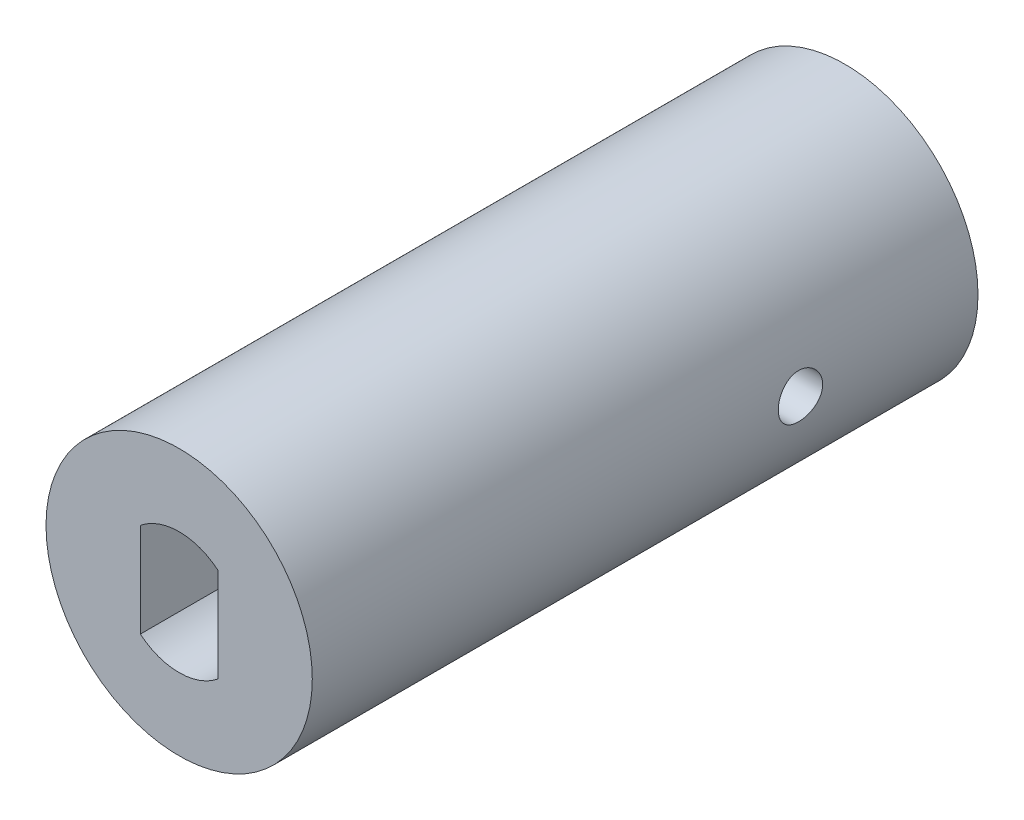
ISO-10303-21;
HEADER;
FILE_DESCRIPTION(('STEP AP214'),'2;1');
FILE_NAME('part.step','',(''),(''),'','','');
FILE_SCHEMA(('AUTOMOTIVE_DESIGN { 1 0 10303 214 1 1 1 1 }'));
ENDSEC;
DATA;
#1=APPLICATION_CONTEXT('core data for automotive mechanical design processes');
#2=APPLICATION_PROTOCOL_DEFINITION('international standard','automotive_design',2000,#1);
#3=PRODUCT_CONTEXT('',#1,'mechanical');
#4=PRODUCT('Part','Part','',(#3));
#5=PRODUCT_RELATED_PRODUCT_CATEGORY('part','',(#4));
#6=PRODUCT_DEFINITION_FORMATION('','',#4);
#7=PRODUCT_DEFINITION_CONTEXT('part definition',#1,'design');
#8=PRODUCT_DEFINITION('design','',#6,#7);
#9=PRODUCT_DEFINITION_SHAPE('','',#8);
#10=(LENGTH_UNIT() NAMED_UNIT(*) SI_UNIT(.MILLI.,.METRE.));
#11=(NAMED_UNIT(*) PLANE_ANGLE_UNIT() SI_UNIT($,.RADIAN.));
#12=(NAMED_UNIT(*) SI_UNIT($,.STERADIAN.) SOLID_ANGLE_UNIT());
#13=UNCERTAINTY_MEASURE_WITH_UNIT(LENGTH_MEASURE(1.E-05),#10,'distance_accuracy_value','');
#14=(GEOMETRIC_REPRESENTATION_CONTEXT(3) GLOBAL_UNCERTAINTY_ASSIGNED_CONTEXT((#13)) GLOBAL_UNIT_ASSIGNED_CONTEXT((#10,
#11,#12)) REPRESENTATION_CONTEXT('',''));
#15=CARTESIAN_POINT('',(0.,0.,0.));
#16=DIRECTION('',(0.,0.,1.));
#17=DIRECTION('',(1.,0.,0.));
#18=AXIS2_PLACEMENT_3D('',#15,#16,#17);
#19=CARTESIAN_POINT('',(0.,0.,30.));
#20=DIRECTION('',(0.,0.,1.));
#21=DIRECTION('',(1.,0.,0.));
#22=AXIS2_PLACEMENT_3D('',#19,#20,#21);
#23=PLANE('',#22);
#24=CARTESIAN_POINT('',(0.,0.,30.));
#25=DIRECTION('',(0.,0.,1.));
#26=DIRECTION('',(1.,0.,0.));
#27=AXIS2_PLACEMENT_3D('',#24,#25,#26);
#28=CIRCLE('',#27,6.);
#29=CARTESIAN_POINT('',(6.,0.,30.));
#30=VERTEX_POINT('',#29);
#31=EDGE_CURVE('E11',#30,#30,#28,.T.);
#32=ORIENTED_EDGE('',*,*,#31,.T.);
#33=EDGE_LOOP('',(#32));
#34=FACE_BOUND('',#33,.T.);
#35=CARTESIAN_POINT('',(0.,0.,30.));
#36=DIRECTION('',(0.,0.,1.));
#37=DIRECTION('',(1.,0.,0.));
#38=AXIS2_PLACEMENT_3D('',#35,#36,#37);
#39=CIRCLE('',#38,2.75);
#40=CARTESIAN_POINT('',(-1.75,-2.12132034355964,30.));
#41=VERTEX_POINT('',#40);
#42=CARTESIAN_POINT('',(1.75,-2.12132034355964,30.));
#43=VERTEX_POINT('',#42);
#44=EDGE_CURVE('E103',#41,#43,#39,.T.);
#45=ORIENTED_EDGE('',*,*,#44,.F.);
#46=DIRECTION('',(0.,1.,0.));
#47=VECTOR('',#46,1.);
#48=CARTESIAN_POINT('',(-1.75,0.,30.));
#49=LINE('',#48,#47);
#50=CARTESIAN_POINT('',(-1.75,2.12132034355964,30.));
#51=VERTEX_POINT('',#50);
#52=EDGE_CURVE('E69',#41,#51,#49,.T.);
#53=ORIENTED_EDGE('',*,*,#52,.T.);
#54=CARTESIAN_POINT('',(0.,0.,30.));
#55=DIRECTION('',(0.,0.,1.));
#56=DIRECTION('',(1.,0.,0.));
#57=AXIS2_PLACEMENT_3D('',#54,#55,#56);
#58=CIRCLE('',#57,2.75);
#59=CARTESIAN_POINT('',(1.75,2.12132034355964,30.));
#60=VERTEX_POINT('',#59);
#61=EDGE_CURVE('E123',#60,#51,#58,.T.);
#62=ORIENTED_EDGE('',*,*,#61,.F.);
#63=DIRECTION('',(0.,1.,0.));
#64=VECTOR('',#63,1.);
#65=CARTESIAN_POINT('',(1.75,0.,30.));
#66=LINE('',#65,#64);
#67=EDGE_CURVE('E134',#43,#60,#66,.T.);
#68=ORIENTED_EDGE('',*,*,#67,.F.);
#69=EDGE_LOOP('',(#45,#53,#62,#68));
#70=FACE_BOUND('',#69,.T.);
#71=ADVANCED_FACE('F45',(#34,#70),#23,.T.);
#72=CARTESIAN_POINT('',(0.,0.,30.));
#73=DIRECTION('',(0.,0.,-1.));
#74=DIRECTION('',(-1.,0.,0.));
#75=AXIS2_PLACEMENT_3D('',#72,#73,#74);
#76=CYLINDRICAL_SURFACE('',#75,6.);
#77=CARTESIAN_POINT('',(-6.,0.,7.));
#78=CARTESIAN_POINT('',(-5.9999990446753,0.0557563619832858,7.00000223557913));
#79=CARTESIAN_POINT('',(-5.99921471165214,0.111543152735528,7.00467890998757));
#80=CARTESIAN_POINT('',(-5.99616137976555,0.221552088669217,7.02325426350613));
#81=CARTESIAN_POINT('',(-5.99389101569556,0.275772747183699,7.03716142276464));
#82=CARTESIAN_POINT('',(-5.9881202729458,0.381041898885057,7.0737661794371));
#83=CARTESIAN_POINT('',(-5.98462090063677,0.43209294737276,7.09645658625623));
#84=CARTESIAN_POINT('',(-5.97677690832828,0.529656736791177,7.14996491682096));
#85=CARTESIAN_POINT('',(-5.97243238501774,0.576169995951436,7.1807819109932));
#86=CARTESIAN_POINT('',(-5.96333326983325,0.663789045716672,7.24998203352818));
#87=CARTESIAN_POINT('',(-5.95857548725943,0.704845161413987,7.28842764585445));
#88=CARTESIAN_POINT('',(-5.94921050750693,0.779955399463971,7.37165918738912));
#89=CARTESIAN_POINT('',(-5.94460331985067,0.814009079756388,7.41644551658264));
#90=CARTESIAN_POINT('',(-5.93603026303912,0.874346850242053,7.51142838647882));
#91=CARTESIAN_POINT('',(-5.93206851636654,0.9005818211444,7.5616565347219));
#92=CARTESIAN_POINT('',(-5.9252791591787,0.944223346164487,7.66588382572025));
#93=CARTESIAN_POINT('',(-5.92245147205723,0.961630496626245,7.71988271347105));
#94=CARTESIAN_POINT('',(-5.91828214737102,0.986965751113923,7.82959210994261));
#95=CARTESIAN_POINT('',(-5.9169270739428,0.99497961165416,7.88528229460056));
#96=CARTESIAN_POINT('',(-5.9158157557466,1.00156669011595,7.99723211075339));
#97=CARTESIAN_POINT('',(-5.91605939782886,1.0001405761556,8.05349170166692));
#98=CARTESIAN_POINT('',(-5.91810571545422,0.98795803935846,8.16437114451018));
#99=CARTESIAN_POINT('',(-5.91989229327567,0.977297952755909,8.21900192141809));
#100=CARTESIAN_POINT('',(-5.92479798084403,0.947101256161378,8.32568852713165));
#101=CARTESIAN_POINT('',(-5.92791713629309,0.927564341727896,8.37774426755542));
#102=CARTESIAN_POINT('',(-5.9351539173364,0.880070898437565,8.47809152937637));
#103=CARTESIAN_POINT('',(-5.9392762684293,0.852074365551885,8.52636376243249));
#104=CARTESIAN_POINT('',(-5.94805167366004,0.788484807022973,8.61756176021536));
#105=CARTESIAN_POINT('',(-5.95270477061715,0.752891168261714,8.66048709298197));
#106=CARTESIAN_POINT('',(-5.96208811151914,0.67459288486362,8.74033043432294));
#107=CARTESIAN_POINT('',(-5.96681859692661,0.63180558554925,8.77716740741603));
#108=CARTESIAN_POINT('',(-5.97577040558689,0.540614099592658,8.84315110506614));
#109=CARTESIAN_POINT('',(-5.97999172555898,0.492209876762568,8.87229778007329));
#110=CARTESIAN_POINT('',(-5.98745557157165,0.391082366466684,8.92208089085451));
#111=CARTESIAN_POINT('',(-5.99069727362979,0.338355490225864,8.9427101677325));
#112=CARTESIAN_POINT('',(-5.99583001205064,0.230119338241092,8.97479768609839));
#113=CARTESIAN_POINT('',(-5.9977211614019,0.174610295671787,8.98625669478949));
#114=CARTESIAN_POINT('',(-5.99992451937074,0.0630839605206497,8.99956854338445));
#115=CARTESIAN_POINT('',(-6.00025501205114,0.00708029486040474,9.00153262872224));
#116=CARTESIAN_POINT('',(-5.99934989768468,-0.104455909155955,8.99609546222875));
#117=CARTESIAN_POINT('',(-5.99811435089647,-0.159988465556816,8.98869457074651));
#118=CARTESIAN_POINT('',(-5.99422730775281,-0.268662470218705,8.96483006026581));
#119=CARTESIAN_POINT('',(-5.99158441920524,-0.321816347354151,8.94842151664395));
#120=CARTESIAN_POINT('',(-5.98517785782144,-0.424618753944176,8.90706619272019));
#121=CARTESIAN_POINT('',(-5.98141412204808,-0.474267086363887,8.88211893294589));
#122=CARTESIAN_POINT('',(-5.97313806520963,-0.569132275787583,8.82413955012129));
#123=CARTESIAN_POINT('',(-5.96861942354809,-0.614306100374859,8.7910379375331));
#124=CARTESIAN_POINT('',(-5.9593538695676,-0.698497434201075,8.71778507384598));
#125=CARTESIAN_POINT('',(-5.95460694068619,-0.737514495878633,8.67763331068933));
#126=CARTESIAN_POINT('',(-5.94536070094338,-0.8086971118632,8.59092098077143));
#127=CARTESIAN_POINT('',(-5.94086446454842,-0.840787504445486,8.54429833379424));
#128=CARTESIAN_POINT('',(-5.93268611911154,-0.896680924117994,8.44625881234458));
#129=CARTESIAN_POINT('',(-5.92900398426408,-0.920484213907928,8.394842089909));
#130=CARTESIAN_POINT('',(-5.92289381479082,-0.959015332589259,8.28888410687515));
#131=CARTESIAN_POINT('',(-5.92046061724426,-0.973780573019177,8.23435676198781));
#132=CARTESIAN_POINT('',(-5.91711086734104,-0.99393418151131,8.1235519483113));
#133=CARTESIAN_POINT('',(-5.91619418313089,-0.999323364778467,8.06727463210718));
#134=CARTESIAN_POINT('',(-5.91598693233605,-1.00054914641894,7.95531793361504));
#135=CARTESIAN_POINT('',(-5.9166762260226,-0.996504054450075,7.89963984856989));
#136=CARTESIAN_POINT('',(-5.91955912581491,-0.979231935582739,7.78976830077969));
#137=CARTESIAN_POINT('',(-5.92175272704486,-0.96600493844499,7.73557483322325));
#138=CARTESIAN_POINT('',(-5.92738942512688,-0.93078979583796,7.63025662508295));
#139=CARTESIAN_POINT('',(-5.93083106887868,-0.908811836240177,7.57912839597759));
#140=CARTESIAN_POINT('',(-5.93857747568883,-0.856730801566363,7.48126573232206));
#141=CARTESIAN_POINT('',(-5.9428822815536,-0.826627323499425,7.43453151585115));
#142=CARTESIAN_POINT('',(-5.95193381618249,-0.758727553748862,7.3461857667569));
#143=CARTESIAN_POINT('',(-5.95668518230521,-0.720844225437459,7.30464159331989));
#144=CARTESIAN_POINT('',(-5.96605748944336,-0.638643612552092,7.22845935821003));
#145=CARTESIAN_POINT('',(-5.97067840010619,-0.594324845165055,7.19382289254473));
#146=CARTESIAN_POINT('',(-5.97930611856888,-0.500147667856112,7.13222069272002));
#147=CARTESIAN_POINT('',(-5.98330846501242,-0.450253115013127,7.10530958427482));
#148=CARTESIAN_POINT('',(-5.9902046704071,-0.346605227751592,7.06029220615603));
#149=CARTESIAN_POINT('',(-5.99309963270993,-0.292855797932004,7.04217716756812));
#150=CARTESIAN_POINT('',(-5.99682316333182,-0.19908132401816,7.01919789034933));
#151=CARTESIAN_POINT('',(-5.99800810909344,-0.159623532119379,7.01201021215361));
#152=CARTESIAN_POINT('',(-5.99959686394448,-0.0801157241279236,7.0024105048621));
#153=CARTESIAN_POINT('',(-6.00000068648257,-0.0400657182433976,6.99999839354506));
#154=CARTESIAN_POINT('',(-6.,0.,7.));
#155=B_SPLINE_CURVE_WITH_KNOTS('',3,(#77,#78,#79,#80,#81,#82,#83,#84,#85,#86,#87,#88,#89,#90,
#91,#92,#93,#94,#95,#96,#97,#98,#99,#100,#101,#102,#103,#104,#105,#106,#107,#108,#109,#110,#111,
#112,#113,#114,#115,#116,#117,#118,#119,#120,#121,#122,#123,#124,#125,#126,#127,#128,#129,#130,
#131,#132,#133,#134,#135,#136,#137,#138,#139,#140,#141,#142,#143,#144,#145,#146,#147,#148,#149,
#150,#151,#152,#153,#154),.UNSPECIFIED.,.T.,.F.,(4,2,2,2,2,2,2,2,2,2,2,2,2,2,2,2,2,2,2,2,2,2,2,
2,2,2,2,2,2,2,2,2,2,2,2,2,2,2,4),(0.,0.167122633975404,0.334399018278168,0.501538746810107,
0.668659365069916,0.837209964249328,1.00577120067943,1.17537008329536,1.34495750750472,
1.51298430841369,1.68099921728355,1.84728208704163,2.01357066010152,2.18065822653023,
2.34775928272229,2.51693107964531,2.68610396654339,2.85541875566361,3.02471937808459,
3.19203153396559,3.35933725214344,3.52563122802566,3.69193454330426,3.85970730250809,
4.02749225221713,4.19701528803047,4.36653294950377,4.53534408936708,4.70414055114647,
4.8708316380908,5.03752218475253,5.20401927290489,5.37052462011734,5.53900553677357,
5.70752533551589,5.8772089264288,6.04672300852029,6.16681699265607,6.28690890910787),.UNSPECIFIED.);
#156=CARTESIAN_POINT('',(-6.,0.,7.));
#157=VERTEX_POINT('',#156);
#158=EDGE_CURVE('E131',#157,#157,#155,.T.);
#159=ORIENTED_EDGE('',*,*,#158,.T.);
#160=EDGE_LOOP('',(#159));
#161=FACE_BOUND('',#160,.T.);
#162=CARTESIAN_POINT('',(6.,0.,7.));
#163=CARTESIAN_POINT('',(5.99999904467529,-0.055756361983286,7.00000223557913));
#164=CARTESIAN_POINT('',(5.99921471165214,-0.111543152735528,7.00467890998757));
#165=CARTESIAN_POINT('',(5.99616137976555,-0.221552088669217,7.02325426350613));
#166=CARTESIAN_POINT('',(5.99389101569556,-0.275772747183699,7.03716142276464));
#167=CARTESIAN_POINT('',(5.9881202729458,-0.381041898885058,7.0737661794371));
#168=CARTESIAN_POINT('',(5.98462090063677,-0.43209294737276,7.09645658625623));
#169=CARTESIAN_POINT('',(5.97677690832828,-0.529656736791178,7.14996491682096));
#170=CARTESIAN_POINT('',(5.97243238501774,-0.576169995951436,7.1807819109932));
#171=CARTESIAN_POINT('',(5.96333326983325,-0.663789045716672,7.24998203352818));
#172=CARTESIAN_POINT('',(5.95857548725943,-0.704845161413987,7.28842764585445));
#173=CARTESIAN_POINT('',(5.94921050750693,-0.779955399463971,7.37165918738912));
#174=CARTESIAN_POINT('',(5.94460331985067,-0.814009079756388,7.41644551658264));
#175=CARTESIAN_POINT('',(5.93603026303912,-0.874346850242053,7.51142838647882));
#176=CARTESIAN_POINT('',(5.93206851636655,-0.9005818211444,7.5616565347219));
#177=CARTESIAN_POINT('',(5.9252791591787,-0.944223346164487,7.66588382572025));
#178=CARTESIAN_POINT('',(5.92245147205723,-0.961630496626245,7.71988271347105));
#179=CARTESIAN_POINT('',(5.91828214737102,-0.986965751113923,7.82959210994262));
#180=CARTESIAN_POINT('',(5.9169270739428,-0.99497961165416,7.88528229460056));
#181=CARTESIAN_POINT('',(5.9158157557466,-1.00156669011595,7.99723211075339));
#182=CARTESIAN_POINT('',(5.91605939782886,-1.0001405761556,8.05349170166692));
#183=CARTESIAN_POINT('',(5.91810571545422,-0.98795803935846,8.16437114451018));
#184=CARTESIAN_POINT('',(5.91989229327567,-0.977297952755909,8.21900192141809));
#185=CARTESIAN_POINT('',(5.92479798084403,-0.947101256161378,8.32568852713165));
#186=CARTESIAN_POINT('',(5.92791713629309,-0.927564341727896,8.37774426755542));
#187=CARTESIAN_POINT('',(5.9351539173364,-0.880070898437565,8.47809152937637));
#188=CARTESIAN_POINT('',(5.9392762684293,-0.852074365551885,8.52636376243249));
#189=CARTESIAN_POINT('',(5.94805167366004,-0.788484807022972,8.61756176021536));
#190=CARTESIAN_POINT('',(5.95270477061715,-0.752891168261714,8.66048709298197));
#191=CARTESIAN_POINT('',(5.96208811151914,-0.67459288486362,8.74033043432294));
#192=CARTESIAN_POINT('',(5.96681859692661,-0.63180558554925,8.77716740741603));
#193=CARTESIAN_POINT('',(5.97577040558689,-0.540614099592659,8.84315110506613));
#194=CARTESIAN_POINT('',(5.97999172555898,-0.492209876762569,8.87229778007329));
#195=CARTESIAN_POINT('',(5.98745557157165,-0.391082366466685,8.92208089085451));
#196=CARTESIAN_POINT('',(5.99069727362979,-0.338355490225865,8.9427101677325));
#197=CARTESIAN_POINT('',(5.99583001205064,-0.230119338241093,8.97479768609839));
#198=CARTESIAN_POINT('',(5.9977211614019,-0.174610295671787,8.98625669478949));
#199=CARTESIAN_POINT('',(5.99992451937074,-0.0630839605206488,8.99956854338445));
#200=CARTESIAN_POINT('',(6.00025501205114,-0.007080294860404,9.00153262872224));
#201=CARTESIAN_POINT('',(5.99934989768468,0.104455909155955,8.99609546222875));
#202=CARTESIAN_POINT('',(5.99811435089647,0.159988465556816,8.98869457074651));
#203=CARTESIAN_POINT('',(5.99422730775281,0.268662470218705,8.96483006026581));
#204=CARTESIAN_POINT('',(5.99158441920524,0.321816347354152,8.94842151664395));
#205=CARTESIAN_POINT('',(5.98517785782144,0.424618753944177,8.90706619272019));
#206=CARTESIAN_POINT('',(5.98141412204808,0.474267086363887,8.88211893294589));
#207=CARTESIAN_POINT('',(5.97313806520963,0.569132275787583,8.82413955012128));
#208=CARTESIAN_POINT('',(5.96861942354809,0.61430610037486,8.7910379375331));
#209=CARTESIAN_POINT('',(5.9593538695676,0.698497434201076,8.71778507384598));
#210=CARTESIAN_POINT('',(5.95460694068619,0.737514495878633,8.67763331068933));
#211=CARTESIAN_POINT('',(5.94536070094338,0.8086971118632,8.59092098077143));
#212=CARTESIAN_POINT('',(5.94086446454842,0.840787504445486,8.54429833379424));
#213=CARTESIAN_POINT('',(5.93268611911154,0.896680924117994,8.44625881234458));
#214=CARTESIAN_POINT('',(5.92900398426408,0.920484213907929,8.394842089909));
#215=CARTESIAN_POINT('',(5.92289381479082,0.959015332589259,8.28888410687515));
#216=CARTESIAN_POINT('',(5.92046061724426,0.973780573019178,8.2343567619878));
#217=CARTESIAN_POINT('',(5.91711086734104,0.993934181511311,8.1235519483113));
#218=CARTESIAN_POINT('',(5.91619418313089,0.999323364778467,8.06727463210718));
#219=CARTESIAN_POINT('',(5.91598693233605,1.00054914641894,7.95531793361504));
#220=CARTESIAN_POINT('',(5.9166762260226,0.996504054450075,7.89963984856989));
#221=CARTESIAN_POINT('',(5.91955912581491,0.979231935582739,7.78976830077969));
#222=CARTESIAN_POINT('',(5.92175272704486,0.96600493844499,7.73557483322325));
#223=CARTESIAN_POINT('',(5.92738942512688,0.93078979583796,7.63025662508295));
#224=CARTESIAN_POINT('',(5.93083106887868,0.908811836240177,7.57912839597759));
#225=CARTESIAN_POINT('',(5.93857747568883,0.856730801566363,7.48126573232206));
#226=CARTESIAN_POINT('',(5.9428822815536,0.826627323499425,7.43453151585115));
#227=CARTESIAN_POINT('',(5.95193381618249,0.758727553748862,7.3461857667569));
#228=CARTESIAN_POINT('',(5.95668518230521,0.720844225437459,7.30464159331989));
#229=CARTESIAN_POINT('',(5.96605748944336,0.638643612552092,7.22845935821003));
#230=CARTESIAN_POINT('',(5.97067840010619,0.594324845165054,7.19382289254473));
#231=CARTESIAN_POINT('',(5.97930611856888,0.500147667856113,7.13222069272002));
#232=CARTESIAN_POINT('',(5.98330846501242,0.450253115013128,7.10530958427482));
#233=CARTESIAN_POINT('',(5.9902046704071,0.346605227751593,7.06029220615603));
#234=CARTESIAN_POINT('',(5.99309963270993,0.292855797932004,7.04217716756812));
#235=CARTESIAN_POINT('',(5.99682316333182,0.19908132401816,7.01919789034933));
#236=CARTESIAN_POINT('',(5.99800810909344,0.159623532119379,7.01201021215361));
#237=CARTESIAN_POINT('',(5.99959686394448,0.0801157241279235,7.0024105048621));
#238=CARTESIAN_POINT('',(6.00000068648256,0.0400657182433976,6.99999839354506));
#239=CARTESIAN_POINT('',(6.,0.,7.));
#240=B_SPLINE_CURVE_WITH_KNOTS('',3,(#162,#163,#164,#165,#166,#167,#168,#169,#170,#171,#172,
#173,#174,#175,#176,#177,#178,#179,#180,#181,#182,#183,#184,#185,#186,#187,#188,#189,#190,#191,
#192,#193,#194,#195,#196,#197,#198,#199,#200,#201,#202,#203,#204,#205,#206,#207,#208,#209,#210,
#211,#212,#213,#214,#215,#216,#217,#218,#219,#220,#221,#222,#223,#224,#225,#226,#227,#228,#229,
#230,#231,#232,#233,#234,#235,#236,#237,#238,#239),.UNSPECIFIED.,.T.,.F.,(4,2,2,2,2,2,2,2,2,2,2,
2,2,2,2,2,2,2,2,2,2,2,2,2,2,2,2,2,2,2,2,2,2,2,2,2,2,2,4),(0.,0.167122633975404,
0.334399018278168,0.501538746810108,0.668659365069916,0.837209964249327,1.00577120067943,
1.17537008329536,1.34495750750472,1.51298430841369,1.68099921728354,1.84728208704163,
2.01357066010152,2.18065822653023,2.34775928272229,2.5169310796453,2.68610396654339,
2.85541875566361,3.02471937808459,3.19203153396559,3.35933725214344,3.52563122802566,
3.69193454330426,3.85970730250809,4.02749225221713,4.19701528803048,4.36653294950377,
4.53534408936709,4.70414055114647,4.8708316380908,5.03752218475253,5.20401927290489,
5.37052462011734,5.53900553677357,5.70752533551589,5.8772089264288,6.04672300852029,
6.16681699265607,6.28690890910787),.UNSPECIFIED.);
#241=CARTESIAN_POINT('',(6.,0.,7.));
#242=VERTEX_POINT('',#241);
#243=EDGE_CURVE('E176',#242,#242,#240,.T.);
#244=ORIENTED_EDGE('',*,*,#243,.T.);
#245=EDGE_LOOP('',(#244));
#246=FACE_BOUND('',#245,.T.);
#247=ORIENTED_EDGE('',*,*,#31,.F.);
#248=EDGE_LOOP('',(#247));
#249=FACE_BOUND('',#248,.T.);
#250=CARTESIAN_POINT('',(0.,0.,0.));
#251=DIRECTION('',(0.,0.,1.));
#252=DIRECTION('',(1.,0.,0.));
#253=AXIS2_PLACEMENT_3D('',#250,#251,#252);
#254=CIRCLE('',#253,6.);
#255=CARTESIAN_POINT('',(6.,0.,0.));
#256=VERTEX_POINT('',#255);
#257=EDGE_CURVE('E61',#256,#256,#254,.T.);
#258=ORIENTED_EDGE('',*,*,#257,.T.);
#259=EDGE_LOOP('',(#258));
#260=FACE_BOUND('',#259,.T.);
#261=ADVANCED_FACE('F47',(#161,#246,#249,#260),#76,.T.);
#262=CARTESIAN_POINT('',(0.,0.,0.));
#263=DIRECTION('',(0.,0.,1.));
#264=DIRECTION('',(1.,0.,0.));
#265=AXIS2_PLACEMENT_3D('',#262,#263,#264);
#266=PLANE('',#265);
#267=CARTESIAN_POINT('',(0.,0.,0.));
#268=DIRECTION('',(0.,0.,-1.));
#269=DIRECTION('',(-1.,0.,0.));
#270=AXIS2_PLACEMENT_3D('',#267,#268,#269);
#271=CIRCLE('',#270,4.);
#272=CARTESIAN_POINT('',(-4.,0.,0.));
#273=VERTEX_POINT('',#272);
#274=EDGE_CURVE('E141',#273,#273,#271,.T.);
#275=ORIENTED_EDGE('',*,*,#274,.F.);
#276=EDGE_LOOP('',(#275));
#277=FACE_BOUND('',#276,.T.);
#278=ORIENTED_EDGE('',*,*,#257,.F.);
#279=EDGE_LOOP('',(#278));
#280=FACE_BOUND('',#279,.T.);
#281=ADVANCED_FACE('F192',(#277,#280),#266,.F.);
#282=CARTESIAN_POINT('',(0.,0.,15.));
#283=DIRECTION('',(0.,0.,-1.));
#284=DIRECTION('',(-1.,0.,0.));
#285=AXIS2_PLACEMENT_3D('',#282,#283,#284);
#286=CYLINDRICAL_SURFACE('',#285,4.);
#287=CARTESIAN_POINT('',(-4.,0.,9.));
#288=CARTESIAN_POINT('',(-3.99999906578675,0.0552507257798208,8.99999844950789));
#289=CARTESIAN_POINT('',(-3.99884385421219,0.110518771887175,8.99540563281747));
#290=CARTESIAN_POINT('',(-3.99434742553262,0.219470882513688,8.977183232462));
#291=CARTESIAN_POINT('',(-3.99100496946646,0.273154031247159,8.96354852697477));
#292=CARTESIAN_POINT('',(-3.98250417554693,0.377347248121717,8.92770716435861));
#293=CARTESIAN_POINT('',(-3.97734801894725,0.427861042286668,8.90551080085648));
#294=CARTESIAN_POINT('',(-3.96576895871729,0.524448087936283,8.85321240663678));
#295=CARTESIAN_POINT('',(-3.95934601236034,0.570521189565838,8.82311010925404));
#296=CARTESIAN_POINT('',(-3.94578275727868,0.657867951533945,8.75519947356386));
#297=CARTESIAN_POINT('',(-3.93863138099022,0.69903712670738,8.71725895002722));
#298=CARTESIAN_POINT('',(-3.92449080078353,0.774499284802202,8.63503186339406));
#299=CARTESIAN_POINT('',(-3.91750161525565,0.808791491299422,8.59074458470234));
#300=CARTESIAN_POINT('',(-3.9043651713314,0.870017695199354,8.49626984884171));
#301=CARTESIAN_POINT('',(-3.89823196313737,0.896834810616904,8.44600451279307));
#302=CARTESIAN_POINT('',(-3.88766329874815,0.941597939033684,8.34150105889443));
#303=CARTESIAN_POINT('',(-3.88322757115193,0.959545370292888,8.28726357778283));
#304=CARTESIAN_POINT('',(-3.87666984478367,0.985703224536193,8.17750433453168));
#305=CARTESIAN_POINT('',(-3.87450327383617,0.994101512222225,8.12203006930014));
#306=CARTESIAN_POINT('',(-3.87259575025161,1.00150785004523,8.01042095399068));
#307=CARTESIAN_POINT('',(-3.87285440299096,1.00051742787865,7.95428621286759));
#308=CARTESIAN_POINT('',(-3.87572803664412,0.98932434975952,7.84438946150368));
#309=CARTESIAN_POINT('',(-3.87828575334586,0.979345560127013,7.79060291902327));
#310=CARTESIAN_POINT('',(-3.88537806450989,0.950816124602071,7.68549263272581));
#311=CARTESIAN_POINT('',(-3.88991279980464,0.932264868046282,7.63416906464734));
#312=CARTESIAN_POINT('',(-3.90050075936124,0.886926318624769,7.53484132249862));
#313=CARTESIAN_POINT('',(-3.90656884979614,0.860057778155274,7.48687588547363));
#314=CARTESIAN_POINT('',(-3.91953140564257,0.79890418400997,7.39605419349544));
#315=CARTESIAN_POINT('',(-3.9264260155649,0.764617832539226,7.35319883462183));
#316=CARTESIAN_POINT('',(-3.94050587026521,0.688442283120812,7.2725309228704));
#317=CARTESIAN_POINT('',(-3.94769379651981,0.646364172110574,7.23489700662577));
#318=CARTESIAN_POINT('',(-3.96137310385857,0.556407945002468,7.1671858383574));
#319=CARTESIAN_POINT('',(-3.96786446366277,0.508529651805297,7.13710881715762));
#320=CARTESIAN_POINT('',(-3.97945154729455,0.408077259120929,7.08529960918374));
#321=CARTESIAN_POINT('',(-3.9845424008515,0.355487595472416,7.06359643983038));
#322=CARTESIAN_POINT('',(-3.99271944660946,0.247250672095256,7.02938846286029));
#323=CARTESIAN_POINT('',(-3.99580602226187,0.191603999433657,7.01688189572124));
#324=CARTESIAN_POINT('',(-3.9995699951425,0.0803599802600183,7.00169495629411));
#325=CARTESIAN_POINT('',(-4.00030702338852,0.0247978133254738,6.9987713159498));
#326=CARTESIAN_POINT('',(-3.999458698763,-0.086021916534338,7.00216600137033));
#327=CARTESIAN_POINT('',(-3.99787355494564,-0.141279506429729,7.00848349519942));
#328=CARTESIAN_POINT('',(-3.99259720751571,-0.249076179184327,7.02998060559425));
#329=CARTESIAN_POINT('',(-3.98893756123874,-0.301643412645835,7.04502750898466));
#330=CARTESIAN_POINT('',(-3.97992471089423,-0.403504861635007,7.08340472268563));
#331=CARTESIAN_POINT('',(-3.97457133579928,-0.452798746021756,7.10673586954211));
#332=CARTESIAN_POINT('',(-3.96262205284207,-0.547682089619897,7.16149075258315));
#333=CARTESIAN_POINT('',(-3.95600578244621,-0.593190294557219,7.19305074159784));
#334=CARTESIAN_POINT('',(-3.94229672791613,-0.678351075762163,7.26319327253131));
#335=CARTESIAN_POINT('',(-3.93520386167803,-0.718002639315337,7.30177702641127));
#336=CARTESIAN_POINT('',(-3.92112637973847,-0.791327045381819,7.38600130722964));
#337=CARTESIAN_POINT('',(-3.91414869458187,-0.824829245081354,7.43179180200161));
#338=CARTESIAN_POINT('',(-3.90128585584826,-0.883673839341798,7.52848842297714));
#339=CARTESIAN_POINT('',(-3.89540065378017,-0.90901659610529,7.57939432197317));
#340=CARTESIAN_POINT('',(-3.88545396489777,-0.950634280406194,7.68460381494205));
#341=CARTESIAN_POINT('',(-3.88138170194604,-0.966962931102709,7.73888508556267));
#342=CARTESIAN_POINT('',(-3.87551162726789,-0.990230439969185,7.84953975859274));
#343=CARTESIAN_POINT('',(-3.87371331813291,-0.997171351652438,7.90591270068833));
#344=CARTESIAN_POINT('',(-3.87263267469304,-1.00135906022266,8.01741401590347));
#345=CARTESIAN_POINT('',(-3.87327955152176,-0.998878598520078,8.07253162341648));
#346=CARTESIAN_POINT('',(-3.87685272671895,-0.984918185541911,8.18153592577865));
#347=CARTESIAN_POINT('',(-3.87977897927904,-0.973438415124512,8.23542264534243));
#348=CARTESIAN_POINT('',(-3.88754173788482,-0.941954212961862,8.34013897271027));
#349=CARTESIAN_POINT('',(-3.89236676824206,-0.922000936453584,8.39098487016014));
#350=CARTESIAN_POINT('',(-3.90338503816552,-0.874176609070047,8.48864358847579));
#351=CARTESIAN_POINT('',(-3.90957846747182,-0.846304460022793,8.53545584879128));
#352=CARTESIAN_POINT('',(-3.92283756175675,-0.782578499091425,8.62503641933468));
#353=CARTESIAN_POINT('',(-3.92992176554505,-0.746535441941503,8.66766738228264));
#354=CARTESIAN_POINT('',(-3.94405351497524,-0.667859580793157,8.74636469653027));
#355=CARTESIAN_POINT('',(-3.95110105151373,-0.625225214174098,8.78242948674198));
#356=CARTESIAN_POINT('',(-3.96451770431775,-0.533645057801727,8.84760753904307));
#357=CARTESIAN_POINT('',(-3.97087222243912,-0.484598948210925,8.87658307578105));
#358=CARTESIAN_POINT('',(-3.98203283316746,-0.382177373006985,8.92583164196035));
#359=CARTESIAN_POINT('',(-3.98684003466521,-0.328805042291161,8.94611090709902));
#360=CARTESIAN_POINT('',(-3.99365373043694,-0.229606835495649,8.97438122021977));
#361=CARTESIAN_POINT('',(-3.9960172336846,-0.184253447272047,8.98396749536896));
#362=CARTESIAN_POINT('',(-3.99919070154632,-0.0926040476908559,8.99677729574796));
#363=CARTESIAN_POINT('',(-4.00000078300596,-0.0463081074950778,9.00000129953686));
#364=CARTESIAN_POINT('',(-4.,0.,9.));
#365=B_SPLINE_CURVE_WITH_KNOTS('',3,(#287,#288,#289,#290,#291,#292,#293,#294,#295,#296,#297,
#298,#299,#300,#301,#302,#303,#304,#305,#306,#307,#308,#309,#310,#311,#312,#313,#314,#315,#316,
#317,#318,#319,#320,#321,#322,#323,#324,#325,#326,#327,#328,#329,#330,#331,#332,#333,#334,#335,
#336,#337,#338,#339,#340,#341,#342,#343,#344,#345,#346,#347,#348,#349,#350,#351,#352,#353,#354,
#355,#356,#357,#358,#359,#360,#361,#362,#363,#364),.UNSPECIFIED.,.T.,.F.,(4,2,2,2,2,2,2,2,2,2,2,
2,2,2,2,2,2,2,2,2,2,2,2,2,2,2,2,2,2,2,2,2,2,2,2,2,2,2,4),(0.,0.16558247498126,0.331258825175932,
0.496736601524069,0.662219960112883,0.830762902914258,0.999324863867078,1.17039098363871,
1.34142974112912,1.50904196732953,1.67662692075131,1.84014998004679,2.00368468977359,
2.16887018582586,2.33408460557442,2.50401000646013,2.67394059705498,2.84445486006076,
3.01493649125762,3.18105539299517,3.34715934075162,3.51080183009358,3.67446084881527,
3.84102391710234,4.00761575338679,4.17829672802984,4.34897012499672,4.51861503076024,
4.68822282168272,4.85295853599075,5.01769093970689,5.18144267039631,5.34521712091267,
5.51326384273273,5.68135046513611,5.85248123666392,6.02348909214233,6.16228161961432,
6.30106370695359),.UNSPECIFIED.);
#366=CARTESIAN_POINT('',(-4.,0.,9.));
#367=VERTEX_POINT('',#366);
#368=EDGE_CURVE('E50',#367,#367,#365,.T.);
#369=ORIENTED_EDGE('',*,*,#368,.T.);
#370=EDGE_LOOP('',(#369));
#371=FACE_BOUND('',#370,.T.);
#372=CARTESIAN_POINT('',(4.,0.,7.));
#373=CARTESIAN_POINT('',(3.99999906578675,0.0552507257798207,7.00000155049211));
#374=CARTESIAN_POINT('',(3.99884385421219,0.110518771887176,7.00459436718253));
#375=CARTESIAN_POINT('',(3.99434742553261,0.219470882513688,7.022816767538));
#376=CARTESIAN_POINT('',(3.99100496946646,0.273154031247159,7.03645147302523));
#377=CARTESIAN_POINT('',(3.98250417554693,0.377347248121718,7.07229283564139));
#378=CARTESIAN_POINT('',(3.97734801894725,0.427861042286669,7.09448919914352));
#379=CARTESIAN_POINT('',(3.96576895871729,0.524448087936285,7.14678759336322));
#380=CARTESIAN_POINT('',(3.95934601236034,0.57052118956584,7.17688989074596));
#381=CARTESIAN_POINT('',(3.94578275727868,0.657867951533947,7.24480052643614));
#382=CARTESIAN_POINT('',(3.93863138099022,0.699037126707382,7.28274104997279));
#383=CARTESIAN_POINT('',(3.92449080078353,0.774499284802203,7.36496813660595));
#384=CARTESIAN_POINT('',(3.91750161525566,0.808791491299423,7.40925541529767));
#385=CARTESIAN_POINT('',(3.9043651713314,0.870017695199355,7.50373015115829));
#386=CARTESIAN_POINT('',(3.89823196313737,0.896834810616904,7.55399548720694));
#387=CARTESIAN_POINT('',(3.88766329874815,0.941597939033685,7.65849894110558));
#388=CARTESIAN_POINT('',(3.88322757115193,0.959545370292888,7.71273642221718));
#389=CARTESIAN_POINT('',(3.87666984478367,0.985703224536193,7.82249566546832));
#390=CARTESIAN_POINT('',(3.87450327383617,0.994101512222226,7.87796993069987));
#391=CARTESIAN_POINT('',(3.87259575025161,1.00150785004523,7.98957904600932));
#392=CARTESIAN_POINT('',(3.87285440299096,1.00051742787865,8.04571378713241));
#393=CARTESIAN_POINT('',(3.87572803664412,0.98932434975952,8.15561053849632));
#394=CARTESIAN_POINT('',(3.87828575334586,0.979345560127013,8.20939708097673));
#395=CARTESIAN_POINT('',(3.88537806450989,0.950816124602071,8.31450736727419));
#396=CARTESIAN_POINT('',(3.88991279980464,0.932264868046282,8.36583093535266));
#397=CARTESIAN_POINT('',(3.90050075936124,0.886926318624769,8.46515867750138));
#398=CARTESIAN_POINT('',(3.90656884979614,0.860057778155274,8.51312411452637));
#399=CARTESIAN_POINT('',(3.91953140564257,0.798904184009969,8.60394580650456));
#400=CARTESIAN_POINT('',(3.9264260155649,0.764617832539226,8.64680116537817));
#401=CARTESIAN_POINT('',(3.94050587026521,0.688442283120812,8.7274690771296));
#402=CARTESIAN_POINT('',(3.94769379651981,0.646364172110573,8.76510299337423));
#403=CARTESIAN_POINT('',(3.96137310385857,0.556407945002467,8.8328141616426));
#404=CARTESIAN_POINT('',(3.96786446366277,0.508529651805296,8.86289118284238));
#405=CARTESIAN_POINT('',(3.97945154729455,0.408077259120929,8.91470039081626));
#406=CARTESIAN_POINT('',(3.9845424008515,0.355487595472416,8.93640356016962));
#407=CARTESIAN_POINT('',(3.99271944660946,0.247250672095256,8.97061153713971));
#408=CARTESIAN_POINT('',(3.99580602226187,0.191603999433657,8.98311810427876));
#409=CARTESIAN_POINT('',(3.9995699951425,0.0803599802600182,8.99830504370589));
#410=CARTESIAN_POINT('',(4.00030702338852,0.0247978133254734,9.0012286840502));
#411=CARTESIAN_POINT('',(3.999458698763,-0.0860219165343386,8.99783399862967));
#412=CARTESIAN_POINT('',(3.99787355494564,-0.14127950642973,8.99151650480058));
#413=CARTESIAN_POINT('',(3.99259720751571,-0.249076179184328,8.97001939440575));
#414=CARTESIAN_POINT('',(3.98893756123874,-0.301643412645836,8.95497249101534));
#415=CARTESIAN_POINT('',(3.97992471089423,-0.403504861635007,8.91659527731437));
#416=CARTESIAN_POINT('',(3.97457133579928,-0.452798746021756,8.89326413045789));
#417=CARTESIAN_POINT('',(3.96262205284207,-0.547682089619898,8.83850924741685));
#418=CARTESIAN_POINT('',(3.95600578244621,-0.59319029455722,8.80694925840216));
#419=CARTESIAN_POINT('',(3.94229672791613,-0.678351075762164,8.73680672746869));
#420=CARTESIAN_POINT('',(3.93520386167803,-0.718002639315339,8.69822297358873));
#421=CARTESIAN_POINT('',(3.92112637973847,-0.79132704538182,8.61399869277036));
#422=CARTESIAN_POINT('',(3.91414869458187,-0.824829245081354,8.56820819799839));
#423=CARTESIAN_POINT('',(3.90128585584826,-0.883673839341798,8.47151157702286));
#424=CARTESIAN_POINT('',(3.89540065378017,-0.909016596105291,8.42060567802683));
#425=CARTESIAN_POINT('',(3.88545396489777,-0.950634280406195,8.31539618505795));
#426=CARTESIAN_POINT('',(3.88138170194604,-0.96696293110271,8.26111491443733));
#427=CARTESIAN_POINT('',(3.87551162726789,-0.990230439969186,8.15046024140726));
#428=CARTESIAN_POINT('',(3.87371331813291,-0.997171351652438,8.09408729931167));
#429=CARTESIAN_POINT('',(3.87263267469304,-1.00135906022266,7.98258598409653));
#430=CARTESIAN_POINT('',(3.87327955152176,-0.998878598520078,7.92746837658351));
#431=CARTESIAN_POINT('',(3.87685272671895,-0.984918185541911,7.81846407422135));
#432=CARTESIAN_POINT('',(3.87977897927904,-0.973438415124512,7.76457735465757));
#433=CARTESIAN_POINT('',(3.88754173788482,-0.941954212961863,7.65986102728973));
#434=CARTESIAN_POINT('',(3.89236676824206,-0.922000936453583,7.60901512983986));
#435=CARTESIAN_POINT('',(3.90338503816552,-0.874176609070047,7.51135641152421));
#436=CARTESIAN_POINT('',(3.90957846747182,-0.846304460022792,7.46454415120872));
#437=CARTESIAN_POINT('',(3.92283756175675,-0.782578499091424,7.37496358066532));
#438=CARTESIAN_POINT('',(3.92992176554505,-0.746535441941503,7.33233261771736));
#439=CARTESIAN_POINT('',(3.94405351497524,-0.667859580793157,7.25363530346973));
#440=CARTESIAN_POINT('',(3.95110105151373,-0.625225214174097,7.21757051325802));
#441=CARTESIAN_POINT('',(3.96451770431775,-0.533645057801727,7.15239246095693));
#442=CARTESIAN_POINT('',(3.97087222243912,-0.484598948210925,7.12341692421895));
#443=CARTESIAN_POINT('',(3.98203283316746,-0.382177373006985,7.07416835803965));
#444=CARTESIAN_POINT('',(3.98684003466521,-0.32880504229116,7.05388909290098));
#445=CARTESIAN_POINT('',(3.99365373043694,-0.229606835495648,7.02561877978023));
#446=CARTESIAN_POINT('',(3.9960172336846,-0.184253447272046,7.01603250463105));
#447=CARTESIAN_POINT('',(3.99919070154632,-0.0926040476908552,7.00322270425204));
#448=CARTESIAN_POINT('',(4.00000078300596,-0.0463081074950774,6.99999870046313));
#449=CARTESIAN_POINT('',(4.,0.,7.));
#450=B_SPLINE_CURVE_WITH_KNOTS('',3,(#372,#373,#374,#375,#376,#377,#378,#379,#380,#381,#382,
#383,#384,#385,#386,#387,#388,#389,#390,#391,#392,#393,#394,#395,#396,#397,#398,#399,#400,#401,
#402,#403,#404,#405,#406,#407,#408,#409,#410,#411,#412,#413,#414,#415,#416,#417,#418,#419,#420,
#421,#422,#423,#424,#425,#426,#427,#428,#429,#430,#431,#432,#433,#434,#435,#436,#437,#438,#439,
#440,#441,#442,#443,#444,#445,#446,#447,#448,#449),.UNSPECIFIED.,.T.,.F.,(4,2,2,2,2,2,2,2,2,2,2,
2,2,2,2,2,2,2,2,2,2,2,2,2,2,2,2,2,2,2,2,2,2,2,2,2,2,2,4),(0.,0.16558247498126,0.331258825175933,
0.496736601524071,0.662219960112885,0.83076290291426,0.999324863867079,1.17039098363871,
1.34142974112912,1.50904196732954,1.67662692075131,1.84014998004679,2.00368468977359,
2.16887018582586,2.33408460557442,2.50401000646013,2.67394059705498,2.84445486006076,
3.01493649125762,3.18105539299517,3.34715934075162,3.51080183009358,3.67446084881527,
3.84102391710235,4.00761575338679,4.17829672802984,4.34897012499672,4.51861503076024,
4.68822282168272,4.85295853599075,5.01769093970689,5.18144267039631,5.34521712091267,
5.51326384273273,5.68135046513611,5.85248123666392,6.02348909214233,6.16228161961432,
6.30106370695359),.UNSPECIFIED.);
#451=CARTESIAN_POINT('',(4.,0.,7.));
#452=VERTEX_POINT('',#451);
#453=EDGE_CURVE('E155',#452,#452,#450,.T.);
#454=ORIENTED_EDGE('',*,*,#453,.T.);
#455=EDGE_LOOP('',(#454));
#456=FACE_BOUND('',#455,.T.);
#457=CARTESIAN_POINT('',(0.,0.,15.));
#458=DIRECTION('',(0.,0.,-1.));
#459=DIRECTION('',(-1.,0.,0.));
#460=AXIS2_PLACEMENT_3D('',#457,#458,#459);
#461=CIRCLE('',#460,4.);
#462=CARTESIAN_POINT('',(-4.,0.,15.));
#463=VERTEX_POINT('',#462);
#464=EDGE_CURVE('E146',#463,#463,#461,.T.);
#465=ORIENTED_EDGE('',*,*,#464,.F.);
#466=EDGE_LOOP('',(#465));
#467=FACE_BOUND('',#466,.T.);
#468=ORIENTED_EDGE('',*,*,#274,.T.);
#469=EDGE_LOOP('',(#468));
#470=FACE_BOUND('',#469,.T.);
#471=ADVANCED_FACE('F161',(#371,#456,#467,#470),#286,.F.);
#472=CARTESIAN_POINT('',(0.,0.,15.));
#473=DIRECTION('',(0.,0.,-1.));
#474=DIRECTION('',(-1.,0.,0.));
#475=AXIS2_PLACEMENT_3D('',#472,#473,#474);
#476=PLANE('',#475);
#477=ORIENTED_EDGE('',*,*,#464,.T.);
#478=EDGE_LOOP('',(#477));
#479=FACE_BOUND('',#478,.T.);
#480=ADVANCED_FACE('F205',(#479),#476,.T.);
#481=CARTESIAN_POINT('',(-1.75,0.,23.));
#482=DIRECTION('',(1.,0.,0.));
#483=DIRECTION('',(0.,0.,-1.));
#484=AXIS2_PLACEMENT_3D('',#481,#482,#483);
#485=PLANE('',#484);
#486=ORIENTED_EDGE('',*,*,#52,.F.);
#487=DIRECTION('',(0.,0.,1.));
#488=VECTOR('',#487,1.);
#489=CARTESIAN_POINT('',(-1.75,-2.12132034355964,23.));
#490=LINE('',#489,#488);
#491=CARTESIAN_POINT('',(-1.75,-2.12132034355964,23.));
#492=VERTEX_POINT('',#491);
#493=EDGE_CURVE('E92',#492,#41,#490,.T.);
#494=ORIENTED_EDGE('',*,*,#493,.F.);
#495=DIRECTION('',(0.,1.,0.));
#496=VECTOR('',#495,1.);
#497=CARTESIAN_POINT('',(-1.75,0.,23.));
#498=LINE('',#497,#496);
#499=CARTESIAN_POINT('',(-1.75,2.12132034355964,23.));
#500=VERTEX_POINT('',#499);
#501=EDGE_CURVE('E75',#492,#500,#498,.T.);
#502=ORIENTED_EDGE('',*,*,#501,.T.);
#503=DIRECTION('',(0.,0.,1.));
#504=VECTOR('',#503,1.);
#505=CARTESIAN_POINT('',(-1.75,2.12132034355964,23.));
#506=LINE('',#505,#504);
#507=EDGE_CURVE('E89',#500,#51,#506,.T.);
#508=ORIENTED_EDGE('',*,*,#507,.T.);
#509=EDGE_LOOP('',(#486,#494,#502,#508));
#510=FACE_BOUND('',#509,.T.);
#511=ADVANCED_FACE('F218',(#510),#485,.T.);
#512=CARTESIAN_POINT('',(0.,0.,23.));
#513=DIRECTION('',(0.,0.,1.));
#514=DIRECTION('',(1.,0.,0.));
#515=AXIS2_PLACEMENT_3D('',#512,#513,#514);
#516=CYLINDRICAL_SURFACE('',#515,2.75);
#517=ORIENTED_EDGE('',*,*,#61,.T.);
#518=ORIENTED_EDGE('',*,*,#507,.F.);
#519=CARTESIAN_POINT('',(0.,0.,23.));
#520=DIRECTION('',(0.,0.,1.));
#521=DIRECTION('',(1.,0.,0.));
#522=AXIS2_PLACEMENT_3D('',#519,#520,#521);
#523=CIRCLE('',#522,2.75);
#524=CARTESIAN_POINT('',(1.75,2.12132034355964,23.));
#525=VERTEX_POINT('',#524);
#526=EDGE_CURVE('E117',#525,#500,#523,.T.);
#527=ORIENTED_EDGE('',*,*,#526,.F.);
#528=DIRECTION('',(0.,0.,1.));
#529=VECTOR('',#528,1.);
#530=CARTESIAN_POINT('',(1.75,2.12132034355964,23.));
#531=LINE('',#530,#529);
#532=EDGE_CURVE('E108',#525,#60,#531,.T.);
#533=ORIENTED_EDGE('',*,*,#532,.T.);
#534=EDGE_LOOP('',(#517,#518,#527,#533));
#535=FACE_BOUND('',#534,.T.);
#536=ADVANCED_FACE('F216',(#535),#516,.F.);
#537=CARTESIAN_POINT('',(1.75,0.,23.));
#538=DIRECTION('',(1.,0.,0.));
#539=DIRECTION('',(0.,0.,-1.));
#540=AXIS2_PLACEMENT_3D('',#537,#538,#539);
#541=PLANE('',#540);
#542=ORIENTED_EDGE('',*,*,#67,.T.);
#543=ORIENTED_EDGE('',*,*,#532,.F.);
#544=DIRECTION('',(0.,1.,0.));
#545=VECTOR('',#544,1.);
#546=CARTESIAN_POINT('',(1.75,0.,23.));
#547=LINE('',#546,#545);
#548=CARTESIAN_POINT('',(1.75,-2.12132034355964,23.));
#549=VERTEX_POINT('',#548);
#550=EDGE_CURVE('E111',#549,#525,#547,.T.);
#551=ORIENTED_EDGE('',*,*,#550,.F.);
#552=DIRECTION('',(0.,0.,1.));
#553=VECTOR('',#552,1.);
#554=CARTESIAN_POINT('',(1.75,-2.12132034355964,23.));
#555=LINE('',#554,#553);
#556=EDGE_CURVE('E97',#549,#43,#555,.T.);
#557=ORIENTED_EDGE('',*,*,#556,.T.);
#558=EDGE_LOOP('',(#542,#543,#551,#557));
#559=FACE_BOUND('',#558,.T.);
#560=ADVANCED_FACE('F112',(#559),#541,.F.);
#561=CARTESIAN_POINT('',(0.,0.,23.));
#562=DIRECTION('',(0.,0.,1.));
#563=DIRECTION('',(1.,0.,0.));
#564=AXIS2_PLACEMENT_3D('',#561,#562,#563);
#565=CYLINDRICAL_SURFACE('',#564,2.75);
#566=ORIENTED_EDGE('',*,*,#44,.T.);
#567=ORIENTED_EDGE('',*,*,#556,.F.);
#568=CARTESIAN_POINT('',(0.,0.,23.));
#569=DIRECTION('',(0.,0.,1.));
#570=DIRECTION('',(1.,0.,0.));
#571=AXIS2_PLACEMENT_3D('',#568,#569,#570);
#572=CIRCLE('',#571,2.75);
#573=EDGE_CURVE('E101',#492,#549,#572,.T.);
#574=ORIENTED_EDGE('',*,*,#573,.F.);
#575=ORIENTED_EDGE('',*,*,#493,.T.);
#576=EDGE_LOOP('',(#566,#567,#574,#575));
#577=FACE_BOUND('',#576,.T.);
#578=ADVANCED_FACE('F99',(#577),#565,.F.);
#579=CARTESIAN_POINT('',(0.,0.,23.));
#580=DIRECTION('',(0.,0.,1.));
#581=DIRECTION('',(1.,0.,0.));
#582=AXIS2_PLACEMENT_3D('',#579,#580,#581);
#583=PLANE('',#582);
#584=ORIENTED_EDGE('',*,*,#501,.F.);
#585=ORIENTED_EDGE('',*,*,#573,.T.);
#586=ORIENTED_EDGE('',*,*,#550,.T.);
#587=ORIENTED_EDGE('',*,*,#526,.T.);
#588=EDGE_LOOP('',(#584,#585,#586,#587));
#589=FACE_BOUND('',#588,.T.);
#590=ADVANCED_FACE('F119',(#589),#583,.T.);
#591=CARTESIAN_POINT('',(-6.,0.,8.));
#592=DIRECTION('',(1.,0.,0.));
#593=DIRECTION('',(0.,0.,-1.));
#594=AXIS2_PLACEMENT_3D('',#591,#592,#593);
#595=CYLINDRICAL_SURFACE('',#594,1.);
#596=ORIENTED_EDGE('',*,*,#453,.F.);
#597=EDGE_LOOP('',(#596));
#598=FACE_BOUND('',#597,.T.);
#599=ORIENTED_EDGE('',*,*,#243,.F.);
#600=EDGE_LOOP('',(#599));
#601=FACE_BOUND('',#600,.T.);
#602=ADVANCED_FACE('F169',(#598,#601),#595,.F.);
#603=ORIENTED_EDGE('',*,*,#368,.F.);
#604=EDGE_LOOP('',(#603));
#605=FACE_BOUND('',#604,.T.);
#606=ORIENTED_EDGE('',*,*,#158,.F.);
#607=EDGE_LOOP('',(#606));
#608=FACE_BOUND('',#607,.T.);
#609=ADVANCED_FACE('F165',(#605,#608),#595,.F.);
#610=CLOSED_SHELL('',(#71,#261,#281,#471,#480,#511,#536,#560,#578,#590,#602,#609));
#611=MANIFOLD_SOLID_BREP('B2',#610);
#612=ADVANCED_BREP_SHAPE_REPRESENTATION('',(#18,#611),#14);
#613=SHAPE_DEFINITION_REPRESENTATION(#9,#612);
ENDSEC;
END-ISO-10303-21;
